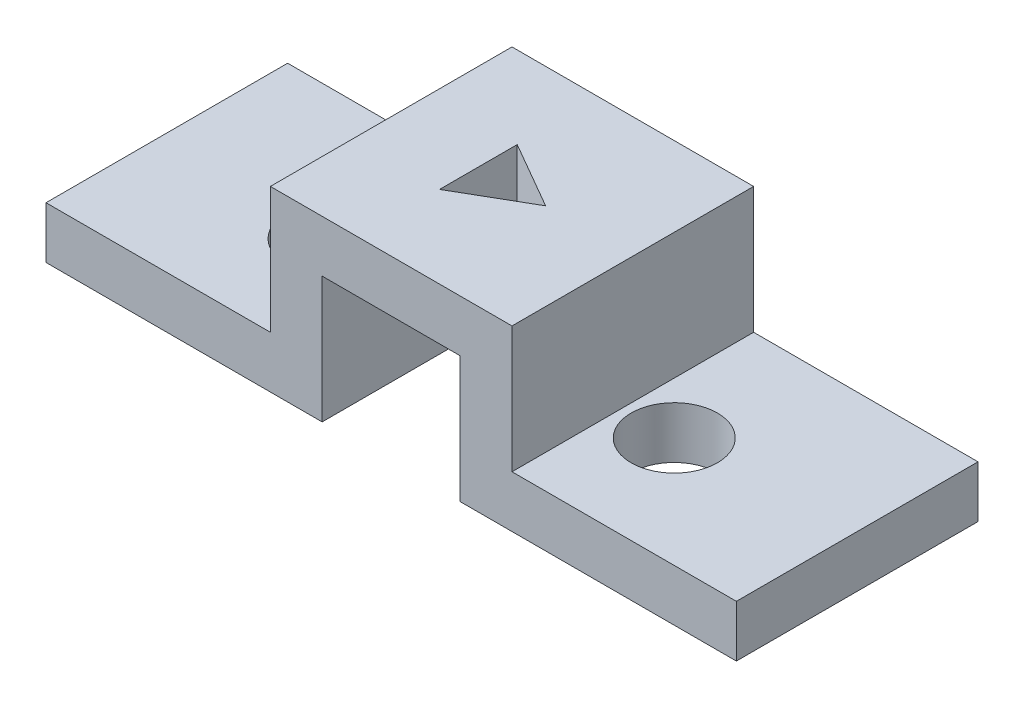
ISO-10303-21;
HEADER;
FILE_DESCRIPTION(('STEP AP214'),'2;1');
FILE_NAME('part.step','',(''),(''),'','','');
FILE_SCHEMA(('AUTOMOTIVE_DESIGN { 1 0 10303 214 1 1 1 1 }'));
ENDSEC;
DATA;
#1=APPLICATION_CONTEXT('core data for automotive mechanical design processes');
#2=APPLICATION_PROTOCOL_DEFINITION('international standard','automotive_design',2000,#1);
#3=PRODUCT_CONTEXT('',#1,'mechanical');
#4=PRODUCT('Part','Part','',(#3));
#5=PRODUCT_RELATED_PRODUCT_CATEGORY('part','',(#4));
#6=PRODUCT_DEFINITION_FORMATION('','',#4);
#7=PRODUCT_DEFINITION_CONTEXT('part definition',#1,'design');
#8=PRODUCT_DEFINITION('design','',#6,#7);
#9=PRODUCT_DEFINITION_SHAPE('','',#8);
#10=(LENGTH_UNIT() NAMED_UNIT(*) SI_UNIT(.MILLI.,.METRE.));
#11=(NAMED_UNIT(*) PLANE_ANGLE_UNIT() SI_UNIT($,.RADIAN.));
#12=(NAMED_UNIT(*) SI_UNIT($,.STERADIAN.) SOLID_ANGLE_UNIT());
#13=UNCERTAINTY_MEASURE_WITH_UNIT(LENGTH_MEASURE(1.E-05),#10,'distance_accuracy_value','');
#14=(GEOMETRIC_REPRESENTATION_CONTEXT(3) GLOBAL_UNCERTAINTY_ASSIGNED_CONTEXT((#13)) GLOBAL_UNIT_ASSIGNED_CONTEXT((#10,
#11,#12)) REPRESENTATION_CONTEXT('',''));
#15=CARTESIAN_POINT('',(0.,0.,0.));
#16=DIRECTION('',(0.,0.,1.));
#17=DIRECTION('',(1.,0.,0.));
#18=AXIS2_PLACEMENT_3D('',#15,#16,#17);
#19=CARTESIAN_POINT('',(-10.,-2.15909090909091,7.));
#20=DIRECTION('',(1.,0.,0.));
#21=DIRECTION('',(0.,1.,0.));
#22=AXIS2_PLACEMENT_3D('',#19,#20,#21);
#23=PLANE('',#22);
#24=DIRECTION('',(0.,-1.,0.));
#25=VECTOR('',#24,1.);
#26=CARTESIAN_POINT('',(-10.,-2.15909090909091,0.));
#27=LINE('',#26,#25);
#28=CARTESIAN_POINT('',(-10.,-2.15909090909091,0.));
#29=VERTEX_POINT('',#28);
#30=CARTESIAN_POINT('',(-10.,-3.65909090909091,0.));
#31=VERTEX_POINT('',#30);
#32=EDGE_CURVE('E186',#29,#31,#27,.T.);
#33=ORIENTED_EDGE('',*,*,#32,.T.);
#34=DIRECTION('',(0.,0.,-1.));
#35=VECTOR('',#34,1.);
#36=CARTESIAN_POINT('',(-10.,-3.65909090909091,7.));
#37=LINE('',#36,#35);
#38=CARTESIAN_POINT('',(-10.,-3.65909090909091,7.));
#39=VERTEX_POINT('',#38);
#40=EDGE_CURVE('E11',#39,#31,#37,.T.);
#41=ORIENTED_EDGE('',*,*,#40,.F.);
#42=DIRECTION('',(0.,-1.,0.));
#43=VECTOR('',#42,1.);
#44=CARTESIAN_POINT('',(-10.,-2.15909090909091,7.));
#45=LINE('',#44,#43);
#46=CARTESIAN_POINT('',(-10.,-2.15909090909091,7.));
#47=VERTEX_POINT('',#46);
#48=EDGE_CURVE('E190',#47,#39,#45,.T.);
#49=ORIENTED_EDGE('',*,*,#48,.F.);
#50=DIRECTION('',(0.,0.,-1.));
#51=VECTOR('',#50,1.);
#52=CARTESIAN_POINT('',(-10.,-2.15909090909091,7.));
#53=LINE('',#52,#51);
#54=EDGE_CURVE('E213',#47,#29,#53,.T.);
#55=ORIENTED_EDGE('',*,*,#54,.T.);
#56=EDGE_LOOP('',(#33,#41,#49,#55));
#57=FACE_BOUND('',#56,.T.);
#58=ADVANCED_FACE('F41',(#57),#23,.F.);
#59=CARTESIAN_POINT('',(-10.,-3.65909090909091,7.));
#60=DIRECTION('',(0.,1.,0.));
#61=DIRECTION('',(0.,0.,1.));
#62=AXIS2_PLACEMENT_3D('',#59,#60,#61);
#63=PLANE('',#62);
#64=CARTESIAN_POINT('',(-5.00078643762691,-3.65909090909091,3.7999999999996));
#65=DIRECTION('',(0.,1.,0.));
#66=DIRECTION('',(0.,0.,-1.));
#67=AXIS2_PLACEMENT_3D('',#64,#65,#66);
#68=CIRCLE('',#67,1.25);
#69=CARTESIAN_POINT('',(-5.00078643762691,-3.65909090909091,2.5499999999996));
#70=VERTEX_POINT('',#69);
#71=EDGE_CURVE('E174',#70,#70,#68,.T.);
#72=ORIENTED_EDGE('',*,*,#71,.T.);
#73=EDGE_LOOP('',(#72));
#74=FACE_BOUND('',#73,.T.);
#75=DIRECTION('',(1.,0.,0.));
#76=VECTOR('',#75,1.);
#77=CARTESIAN_POINT('',(-10.,-3.65909090909091,0.));
#78=LINE('',#77,#76);
#79=CARTESIAN_POINT('',(-2.,-3.65909090909091,0.));
#80=VERTEX_POINT('',#79);
#81=EDGE_CURVE('E216',#31,#80,#78,.T.);
#82=ORIENTED_EDGE('',*,*,#81,.T.);
#83=DIRECTION('',(0.,0.,-1.));
#84=VECTOR('',#83,1.);
#85=CARTESIAN_POINT('',(-2.,-3.65909090909091,7.));
#86=LINE('',#85,#84);
#87=CARTESIAN_POINT('',(-2.,-3.65909090909091,7.));
#88=VERTEX_POINT('',#87);
#89=EDGE_CURVE('E48',#88,#80,#86,.T.);
#90=ORIENTED_EDGE('',*,*,#89,.F.);
#91=DIRECTION('',(1.,0.,0.));
#92=VECTOR('',#91,1.);
#93=CARTESIAN_POINT('',(-10.,-3.65909090909091,7.));
#94=LINE('',#93,#92);
#95=EDGE_CURVE('E189',#39,#88,#94,.T.);
#96=ORIENTED_EDGE('',*,*,#95,.F.);
#97=ORIENTED_EDGE('',*,*,#40,.T.);
#98=EDGE_LOOP('',(#82,#90,#96,#97));
#99=FACE_BOUND('',#98,.T.);
#100=ADVANCED_FACE('F291',(#74,#99),#63,.F.);
#101=CARTESIAN_POINT('',(-2.,-3.65909090909091,7.));
#102=DIRECTION('',(-1.,0.,0.));
#103=DIRECTION('',(0.,0.,1.));
#104=AXIS2_PLACEMENT_3D('',#101,#102,#103);
#105=PLANE('',#104);
#106=DIRECTION('',(0.,1.,0.));
#107=VECTOR('',#106,1.);
#108=CARTESIAN_POINT('',(-2.,-3.65909090909091,0.));
#109=LINE('',#108,#107);
#110=CARTESIAN_POINT('',(-2.,0.,0.));
#111=VERTEX_POINT('',#110);
#112=EDGE_CURVE('E217',#80,#111,#109,.T.);
#113=ORIENTED_EDGE('',*,*,#112,.T.);
#114=DIRECTION('',(0.,0.,-1.));
#115=VECTOR('',#114,1.);
#116=CARTESIAN_POINT('',(-2.,0.,7.));
#117=LINE('',#116,#115);
#118=CARTESIAN_POINT('',(-2.,0.,7.));
#119=VERTEX_POINT('',#118);
#120=EDGE_CURVE('E263',#119,#111,#117,.T.);
#121=ORIENTED_EDGE('',*,*,#120,.F.);
#122=DIRECTION('',(0.,1.,0.));
#123=VECTOR('',#122,1.);
#124=CARTESIAN_POINT('',(-2.,-3.65909090909091,7.));
#125=LINE('',#124,#123);
#126=EDGE_CURVE('E191',#88,#119,#125,.T.);
#127=ORIENTED_EDGE('',*,*,#126,.F.);
#128=ORIENTED_EDGE('',*,*,#89,.T.);
#129=EDGE_LOOP('',(#113,#121,#127,#128));
#130=FACE_BOUND('',#129,.T.);
#131=ADVANCED_FACE('F269',(#130),#105,.F.);
#132=CARTESIAN_POINT('',(-2.,0.,7.));
#133=DIRECTION('',(0.,1.,0.));
#134=DIRECTION('',(0.,0.,1.));
#135=AXIS2_PLACEMENT_3D('',#132,#133,#134);
#136=PLANE('',#135);
#137=DIRECTION('',(-0.866025403784439,0.,0.5));
#138=VECTOR('',#137,1.);
#139=CARTESIAN_POINT('',(0.974278579257494,0.,3.5));
#140=LINE('',#139,#138);
#141=CARTESIAN_POINT('',(0.974278579257493,0.,3.5));
#142=VERTEX_POINT('',#141);
#143=CARTESIAN_POINT('',(-0.974278579257493,0.,4.625));
#144=VERTEX_POINT('',#143);
#145=EDGE_CURVE('E167',#142,#144,#140,.T.);
#146=ORIENTED_EDGE('',*,*,#145,.F.);
#147=DIRECTION('',(0.866025403784438,0.,0.5));
#148=VECTOR('',#147,1.);
#149=CARTESIAN_POINT('',(-0.974278579257493,0.,2.375));
#150=LINE('',#149,#148);
#151=CARTESIAN_POINT('',(-0.974278579257493,0.,2.375));
#152=VERTEX_POINT('',#151);
#153=EDGE_CURVE('E54',#152,#142,#150,.T.);
#154=ORIENTED_EDGE('',*,*,#153,.F.);
#155=DIRECTION('',(0.,0.,-1.));
#156=VECTOR('',#155,1.);
#157=CARTESIAN_POINT('',(-0.974278579257493,0.,4.625));
#158=LINE('',#157,#156);
#159=EDGE_CURVE('E152',#144,#152,#158,.T.);
#160=ORIENTED_EDGE('',*,*,#159,.F.);
#161=EDGE_LOOP('',(#146,#154,#160));
#162=FACE_BOUND('',#161,.T.);
#163=DIRECTION('',(1.,0.,0.));
#164=VECTOR('',#163,1.);
#165=CARTESIAN_POINT('',(-2.,0.,0.));
#166=LINE('',#165,#164);
#167=CARTESIAN_POINT('',(2.,0.,0.));
#168=VERTEX_POINT('',#167);
#169=EDGE_CURVE('E219',#111,#168,#166,.T.);
#170=ORIENTED_EDGE('',*,*,#169,.T.);
#171=DIRECTION('',(0.,0.,-1.));
#172=VECTOR('',#171,1.);
#173=CARTESIAN_POINT('',(2.,0.,7.));
#174=LINE('',#173,#172);
#175=CARTESIAN_POINT('',(2.,0.,7.));
#176=VERTEX_POINT('',#175);
#177=EDGE_CURVE('E257',#176,#168,#174,.T.);
#178=ORIENTED_EDGE('',*,*,#177,.F.);
#179=DIRECTION('',(1.,0.,0.));
#180=VECTOR('',#179,1.);
#181=CARTESIAN_POINT('',(-2.,0.,7.));
#182=LINE('',#181,#180);
#183=EDGE_CURVE('E192',#119,#176,#182,.T.);
#184=ORIENTED_EDGE('',*,*,#183,.F.);
#185=ORIENTED_EDGE('',*,*,#120,.T.);
#186=EDGE_LOOP('',(#170,#178,#184,#185));
#187=FACE_BOUND('',#186,.T.);
#188=ADVANCED_FACE('F281',(#162,#187),#136,.F.);
#189=CARTESIAN_POINT('',(2.,-3.65909090909091,7.));
#190=DIRECTION('',(1.,0.,0.));
#191=DIRECTION('',(0.,0.,-1.));
#192=AXIS2_PLACEMENT_3D('',#189,#190,#191);
#193=PLANE('',#192);
#194=DIRECTION('',(0.,-1.,0.));
#195=VECTOR('',#194,1.);
#196=CARTESIAN_POINT('',(2.,-3.65909090909091,0.));
#197=LINE('',#196,#195);
#198=CARTESIAN_POINT('',(2.,-3.65909090909091,0.));
#199=VERTEX_POINT('',#198);
#200=EDGE_CURVE('E225',#168,#199,#197,.T.);
#201=ORIENTED_EDGE('',*,*,#200,.T.);
#202=DIRECTION('',(0.,0.,-1.));
#203=VECTOR('',#202,1.);
#204=CARTESIAN_POINT('',(2.,-3.65909090909091,7.));
#205=LINE('',#204,#203);
#206=CARTESIAN_POINT('',(2.,-3.65909090909091,7.));
#207=VERTEX_POINT('',#206);
#208=EDGE_CURVE('E260',#207,#199,#205,.T.);
#209=ORIENTED_EDGE('',*,*,#208,.F.);
#210=DIRECTION('',(0.,-1.,0.));
#211=VECTOR('',#210,1.);
#212=CARTESIAN_POINT('',(2.,-3.65909090909091,7.));
#213=LINE('',#212,#211);
#214=EDGE_CURVE('E197',#176,#207,#213,.T.);
#215=ORIENTED_EDGE('',*,*,#214,.F.);
#216=ORIENTED_EDGE('',*,*,#177,.T.);
#217=EDGE_LOOP('',(#201,#209,#215,#216));
#218=FACE_BOUND('',#217,.T.);
#219=ADVANCED_FACE('F284',(#218),#193,.F.);
#220=CARTESIAN_POINT('',(10.,-3.65909090909091,7.));
#221=DIRECTION('',(0.,1.,0.));
#222=DIRECTION('',(0.,0.,1.));
#223=AXIS2_PLACEMENT_3D('',#220,#221,#222);
#224=PLANE('',#223);
#225=CARTESIAN_POINT('',(5.00078643762691,-3.65909090909091,3.7999999999996));
#226=DIRECTION('',(0.,-1.,0.));
#227=DIRECTION('',(0.,0.,-1.));
#228=AXIS2_PLACEMENT_3D('',#225,#226,#227);
#229=CIRCLE('',#228,1.25);
#230=CARTESIAN_POINT('',(5.00078643762691,-3.65909090909091,2.5499999999996));
#231=VERTEX_POINT('',#230);
#232=EDGE_CURVE('E176',#231,#231,#229,.T.);
#233=ORIENTED_EDGE('',*,*,#232,.F.);
#234=EDGE_LOOP('',(#233));
#235=FACE_BOUND('',#234,.T.);
#236=DIRECTION('',(1.,0.,0.));
#237=VECTOR('',#236,1.);
#238=CARTESIAN_POINT('',(10.,-3.65909090909091,0.));
#239=LINE('',#238,#237);
#240=CARTESIAN_POINT('',(10.,-3.65909090909091,0.));
#241=VERTEX_POINT('',#240);
#242=EDGE_CURVE('E221',#199,#241,#239,.T.);
#243=ORIENTED_EDGE('',*,*,#242,.T.);
#244=DIRECTION('',(0.,0.,-1.));
#245=VECTOR('',#244,1.);
#246=CARTESIAN_POINT('',(10.,-3.65909090909091,7.));
#247=LINE('',#246,#245);
#248=CARTESIAN_POINT('',(10.,-3.65909090909091,7.));
#249=VERTEX_POINT('',#248);
#250=EDGE_CURVE('E255',#249,#241,#247,.T.);
#251=ORIENTED_EDGE('',*,*,#250,.F.);
#252=DIRECTION('',(1.,0.,0.));
#253=VECTOR('',#252,1.);
#254=CARTESIAN_POINT('',(10.,-3.65909090909091,7.));
#255=LINE('',#254,#253);
#256=EDGE_CURVE('E200',#207,#249,#255,.T.);
#257=ORIENTED_EDGE('',*,*,#256,.F.);
#258=ORIENTED_EDGE('',*,*,#208,.T.);
#259=EDGE_LOOP('',(#243,#251,#257,#258));
#260=FACE_BOUND('',#259,.T.);
#261=ADVANCED_FACE('F322',(#235,#260),#224,.F.);
#262=CARTESIAN_POINT('',(10.,-2.15909090909091,7.));
#263=DIRECTION('',(-1.,0.,0.));
#264=DIRECTION('',(0.,-1.,0.));
#265=AXIS2_PLACEMENT_3D('',#262,#263,#264);
#266=PLANE('',#265);
#267=DIRECTION('',(0.,1.,0.));
#268=VECTOR('',#267,1.);
#269=CARTESIAN_POINT('',(10.,-2.15909090909091,0.));
#270=LINE('',#269,#268);
#271=CARTESIAN_POINT('',(10.,-2.15909090909091,0.));
#272=VERTEX_POINT('',#271);
#273=EDGE_CURVE('E226',#241,#272,#270,.T.);
#274=ORIENTED_EDGE('',*,*,#273,.T.);
#275=DIRECTION('',(0.,0.,-1.));
#276=VECTOR('',#275,1.);
#277=CARTESIAN_POINT('',(10.,-2.15909090909091,7.));
#278=LINE('',#277,#276);
#279=CARTESIAN_POINT('',(10.,-2.15909090909091,7.));
#280=VERTEX_POINT('',#279);
#281=EDGE_CURVE('E253',#280,#272,#278,.T.);
#282=ORIENTED_EDGE('',*,*,#281,.F.);
#283=DIRECTION('',(0.,1.,0.));
#284=VECTOR('',#283,1.);
#285=CARTESIAN_POINT('',(10.,-2.15909090909091,7.));
#286=LINE('',#285,#284);
#287=EDGE_CURVE('E203',#249,#280,#286,.T.);
#288=ORIENTED_EDGE('',*,*,#287,.F.);
#289=ORIENTED_EDGE('',*,*,#250,.T.);
#290=EDGE_LOOP('',(#274,#282,#288,#289));
#291=FACE_BOUND('',#290,.T.);
#292=ADVANCED_FACE('F325',(#291),#266,.F.);
#293=CARTESIAN_POINT('',(3.5,-2.15909090909091,7.));
#294=DIRECTION('',(0.,-1.,0.));
#295=DIRECTION('',(1.,0.,0.));
#296=AXIS2_PLACEMENT_3D('',#293,#294,#295);
#297=PLANE('',#296);
#298=CARTESIAN_POINT('',(5.00078643762691,-2.15909090909091,3.7999999999996));
#299=DIRECTION('',(0.,-1.,0.));
#300=DIRECTION('',(1.,0.,0.));
#301=AXIS2_PLACEMENT_3D('',#298,#299,#300);
#302=CIRCLE('',#301,1.25);
#303=CARTESIAN_POINT('',(6.25078643762691,-2.15909090909091,3.7999999999996));
#304=VERTEX_POINT('',#303);
#305=EDGE_CURVE('E181',#304,#304,#302,.F.);
#306=ORIENTED_EDGE('',*,*,#305,.F.);
#307=EDGE_LOOP('',(#306));
#308=FACE_BOUND('',#307,.T.);
#309=DIRECTION('',(-1.,0.,0.));
#310=VECTOR('',#309,1.);
#311=CARTESIAN_POINT('',(3.5,-2.15909090909091,0.));
#312=LINE('',#311,#310);
#313=CARTESIAN_POINT('',(3.5,-2.15909090909091,0.));
#314=VERTEX_POINT('',#313);
#315=EDGE_CURVE('E227',#272,#314,#312,.T.);
#316=ORIENTED_EDGE('',*,*,#315,.T.);
#317=DIRECTION('',(0.,0.,-1.));
#318=VECTOR('',#317,1.);
#319=CARTESIAN_POINT('',(3.5,-2.15909090909091,7.));
#320=LINE('',#319,#318);
#321=CARTESIAN_POINT('',(3.5,-2.15909090909091,7.));
#322=VERTEX_POINT('',#321);
#323=EDGE_CURVE('E246',#322,#314,#320,.T.);
#324=ORIENTED_EDGE('',*,*,#323,.F.);
#325=DIRECTION('',(-1.,0.,0.));
#326=VECTOR('',#325,1.);
#327=CARTESIAN_POINT('',(3.5,-2.15909090909091,7.));
#328=LINE('',#327,#326);
#329=EDGE_CURVE('E201',#280,#322,#328,.T.);
#330=ORIENTED_EDGE('',*,*,#329,.F.);
#331=ORIENTED_EDGE('',*,*,#281,.T.);
#332=EDGE_LOOP('',(#316,#324,#330,#331));
#333=FACE_BOUND('',#332,.T.);
#334=ADVANCED_FACE('F318',(#308,#333),#297,.F.);
#335=CARTESIAN_POINT('',(3.5,1.5,7.));
#336=DIRECTION('',(-1.,0.,0.));
#337=DIRECTION('',(0.,-1.,0.));
#338=AXIS2_PLACEMENT_3D('',#335,#336,#337);
#339=PLANE('',#338);
#340=DIRECTION('',(0.,1.,0.));
#341=VECTOR('',#340,1.);
#342=CARTESIAN_POINT('',(3.5,1.5,0.));
#343=LINE('',#342,#341);
#344=CARTESIAN_POINT('',(3.5,1.5,0.));
#345=VERTEX_POINT('',#344);
#346=EDGE_CURVE('E229',#314,#345,#343,.T.);
#347=ORIENTED_EDGE('',*,*,#346,.T.);
#348=DIRECTION('',(0.,0.,-1.));
#349=VECTOR('',#348,1.);
#350=CARTESIAN_POINT('',(3.5,1.5,7.));
#351=LINE('',#350,#349);
#352=CARTESIAN_POINT('',(3.5,1.5,7.));
#353=VERTEX_POINT('',#352);
#354=EDGE_CURVE('E244',#353,#345,#351,.T.);
#355=ORIENTED_EDGE('',*,*,#354,.F.);
#356=DIRECTION('',(0.,1.,0.));
#357=VECTOR('',#356,1.);
#358=CARTESIAN_POINT('',(3.5,1.5,7.));
#359=LINE('',#358,#357);
#360=EDGE_CURVE('E202',#322,#353,#359,.T.);
#361=ORIENTED_EDGE('',*,*,#360,.F.);
#362=ORIENTED_EDGE('',*,*,#323,.T.);
#363=EDGE_LOOP('',(#347,#355,#361,#362));
#364=FACE_BOUND('',#363,.T.);
#365=ADVANCED_FACE('F311',(#364),#339,.F.);
#366=CARTESIAN_POINT('',(3.5,1.5,7.));
#367=DIRECTION('',(0.,-1.,0.));
#368=DIRECTION('',(0.,0.,-1.));
#369=AXIS2_PLACEMENT_3D('',#366,#367,#368);
#370=PLANE('',#369);
#371=DIRECTION('',(0.,0.,1.));
#372=VECTOR('',#371,1.);
#373=CARTESIAN_POINT('',(-0.974278579257493,1.5,4.625));
#374=LINE('',#373,#372);
#375=CARTESIAN_POINT('',(-0.974278579257493,1.5,2.375));
#376=VERTEX_POINT('',#375);
#377=CARTESIAN_POINT('',(-0.974278579257493,1.5,4.625));
#378=VERTEX_POINT('',#377);
#379=EDGE_CURVE('E62',#376,#378,#374,.T.);
#380=ORIENTED_EDGE('',*,*,#379,.F.);
#381=DIRECTION('',(-0.866025403784439,0.,-0.5));
#382=VECTOR('',#381,1.);
#383=CARTESIAN_POINT('',(-0.974278579257493,1.5,2.375));
#384=LINE('',#383,#382);
#385=CARTESIAN_POINT('',(0.974278579257494,1.5,3.5));
#386=VERTEX_POINT('',#385);
#387=EDGE_CURVE('E149',#386,#376,#384,.T.);
#388=ORIENTED_EDGE('',*,*,#387,.F.);
#389=DIRECTION('',(0.866025403784439,0.,-0.5));
#390=VECTOR('',#389,1.);
#391=CARTESIAN_POINT('',(0.974278579257494,1.5,3.5));
#392=LINE('',#391,#390);
#393=EDGE_CURVE('E160',#378,#386,#392,.T.);
#394=ORIENTED_EDGE('',*,*,#393,.F.);
#395=EDGE_LOOP('',(#380,#388,#394));
#396=FACE_BOUND('',#395,.T.);
#397=DIRECTION('',(-1.,0.,0.));
#398=VECTOR('',#397,1.);
#399=CARTESIAN_POINT('',(3.5,1.5,0.));
#400=LINE('',#399,#398);
#401=CARTESIAN_POINT('',(-3.5,1.5,0.));
#402=VERTEX_POINT('',#401);
#403=EDGE_CURVE('E235',#345,#402,#400,.T.);
#404=ORIENTED_EDGE('',*,*,#403,.T.);
#405=DIRECTION('',(0.,0.,-1.));
#406=VECTOR('',#405,1.);
#407=CARTESIAN_POINT('',(-3.5,1.5,7.));
#408=LINE('',#407,#406);
#409=CARTESIAN_POINT('',(-3.5,1.5,7.));
#410=VERTEX_POINT('',#409);
#411=EDGE_CURVE('E245',#410,#402,#408,.T.);
#412=ORIENTED_EDGE('',*,*,#411,.F.);
#413=DIRECTION('',(-1.,0.,0.));
#414=VECTOR('',#413,1.);
#415=CARTESIAN_POINT('',(3.5,1.5,7.));
#416=LINE('',#415,#414);
#417=EDGE_CURVE('E210',#353,#410,#416,.T.);
#418=ORIENTED_EDGE('',*,*,#417,.F.);
#419=ORIENTED_EDGE('',*,*,#354,.T.);
#420=EDGE_LOOP('',(#404,#412,#418,#419));
#421=FACE_BOUND('',#420,.T.);
#422=ADVANCED_FACE('F162',(#396,#421),#370,.F.);
#423=CARTESIAN_POINT('',(-3.5,1.5,7.));
#424=DIRECTION('',(1.,0.,0.));
#425=DIRECTION('',(0.,1.,0.));
#426=AXIS2_PLACEMENT_3D('',#423,#424,#425);
#427=PLANE('',#426);
#428=DIRECTION('',(0.,-1.,0.));
#429=VECTOR('',#428,1.);
#430=CARTESIAN_POINT('',(-3.5,1.5,0.));
#431=LINE('',#430,#429);
#432=CARTESIAN_POINT('',(-3.5,-2.15909090909091,0.));
#433=VERTEX_POINT('',#432);
#434=EDGE_CURVE('E234',#402,#433,#431,.T.);
#435=ORIENTED_EDGE('',*,*,#434,.T.);
#436=DIRECTION('',(0.,0.,-1.));
#437=VECTOR('',#436,1.);
#438=CARTESIAN_POINT('',(-3.5,-2.15909090909091,7.));
#439=LINE('',#438,#437);
#440=CARTESIAN_POINT('',(-3.5,-2.15909090909091,7.));
#441=VERTEX_POINT('',#440);
#442=EDGE_CURVE('E239',#441,#433,#439,.T.);
#443=ORIENTED_EDGE('',*,*,#442,.F.);
#444=DIRECTION('',(0.,-1.,0.));
#445=VECTOR('',#444,1.);
#446=CARTESIAN_POINT('',(-3.5,1.5,7.));
#447=LINE('',#446,#445);
#448=EDGE_CURVE('E207',#410,#441,#447,.T.);
#449=ORIENTED_EDGE('',*,*,#448,.F.);
#450=ORIENTED_EDGE('',*,*,#411,.T.);
#451=EDGE_LOOP('',(#435,#443,#449,#450));
#452=FACE_BOUND('',#451,.T.);
#453=ADVANCED_FACE('F302',(#452),#427,.F.);
#454=CARTESIAN_POINT('',(-3.5,-2.15909090909091,7.));
#455=DIRECTION('',(0.,-1.,0.));
#456=DIRECTION('',(1.,0.,0.));
#457=AXIS2_PLACEMENT_3D('',#454,#455,#456);
#458=PLANE('',#457);
#459=CARTESIAN_POINT('',(-5.00078643762691,-2.15909090909091,3.7999999999996));
#460=DIRECTION('',(0.,-1.,0.));
#461=DIRECTION('',(1.,0.,0.));
#462=AXIS2_PLACEMENT_3D('',#459,#460,#461);
#463=CIRCLE('',#462,1.25);
#464=CARTESIAN_POINT('',(-3.75078643762691,-2.15909090909091,3.7999999999996));
#465=VERTEX_POINT('',#464);
#466=EDGE_CURVE('E159',#465,#465,#463,.T.);
#467=ORIENTED_EDGE('',*,*,#466,.T.);
#468=EDGE_LOOP('',(#467));
#469=FACE_BOUND('',#468,.T.);
#470=DIRECTION('',(-1.,0.,0.));
#471=VECTOR('',#470,1.);
#472=CARTESIAN_POINT('',(-3.5,-2.15909090909091,0.));
#473=LINE('',#472,#471);
#474=EDGE_CURVE('E193',#433,#29,#473,.T.);
#475=ORIENTED_EDGE('',*,*,#474,.T.);
#476=ORIENTED_EDGE('',*,*,#54,.F.);
#477=DIRECTION('',(-1.,0.,0.));
#478=VECTOR('',#477,1.);
#479=CARTESIAN_POINT('',(-3.5,-2.15909090909091,7.));
#480=LINE('',#479,#478);
#481=EDGE_CURVE('E211',#441,#47,#480,.T.);
#482=ORIENTED_EDGE('',*,*,#481,.F.);
#483=ORIENTED_EDGE('',*,*,#442,.T.);
#484=EDGE_LOOP('',(#475,#476,#482,#483));
#485=FACE_BOUND('',#484,.T.);
#486=ADVANCED_FACE('F299',(#469,#485),#458,.F.);
#487=CARTESIAN_POINT('',(0.,0.,7.));
#488=DIRECTION('',(0.,0.,1.));
#489=DIRECTION('',(1.,0.,0.));
#490=AXIS2_PLACEMENT_3D('',#487,#488,#489);
#491=PLANE('',#490);
#492=ORIENTED_EDGE('',*,*,#48,.T.);
#493=ORIENTED_EDGE('',*,*,#95,.T.);
#494=ORIENTED_EDGE('',*,*,#126,.T.);
#495=ORIENTED_EDGE('',*,*,#183,.T.);
#496=ORIENTED_EDGE('',*,*,#214,.T.);
#497=ORIENTED_EDGE('',*,*,#256,.T.);
#498=ORIENTED_EDGE('',*,*,#287,.T.);
#499=ORIENTED_EDGE('',*,*,#329,.T.);
#500=ORIENTED_EDGE('',*,*,#360,.T.);
#501=ORIENTED_EDGE('',*,*,#417,.T.);
#502=ORIENTED_EDGE('',*,*,#448,.T.);
#503=ORIENTED_EDGE('',*,*,#481,.T.);
#504=EDGE_LOOP('',(#492,#493,#494,#495,#496,#497,#498,#499,#500,#501,#502,#503));
#505=FACE_BOUND('',#504,.T.);
#506=ADVANCED_FACE('F289',(#505),#491,.T.);
#507=CARTESIAN_POINT('',(0.,0.,0.));
#508=DIRECTION('',(0.,0.,1.));
#509=DIRECTION('',(1.,0.,0.));
#510=AXIS2_PLACEMENT_3D('',#507,#508,#509);
#511=PLANE('',#510);
#512=ORIENTED_EDGE('',*,*,#32,.F.);
#513=ORIENTED_EDGE('',*,*,#474,.F.);
#514=ORIENTED_EDGE('',*,*,#434,.F.);
#515=ORIENTED_EDGE('',*,*,#403,.F.);
#516=ORIENTED_EDGE('',*,*,#346,.F.);
#517=ORIENTED_EDGE('',*,*,#315,.F.);
#518=ORIENTED_EDGE('',*,*,#273,.F.);
#519=ORIENTED_EDGE('',*,*,#242,.F.);
#520=ORIENTED_EDGE('',*,*,#200,.F.);
#521=ORIENTED_EDGE('',*,*,#169,.F.);
#522=ORIENTED_EDGE('',*,*,#112,.F.);
#523=ORIENTED_EDGE('',*,*,#81,.F.);
#524=EDGE_LOOP('',(#512,#513,#514,#515,#516,#517,#518,#519,#520,#521,#522,#523));
#525=FACE_BOUND('',#524,.T.);
#526=ADVANCED_FACE('F277',(#525),#511,.F.);
#527=CARTESIAN_POINT('',(5.00078643762691,1.501,3.7999999999996));
#528=DIRECTION('',(0.,-1.,0.));
#529=DIRECTION('',(0.,0.,-1.));
#530=AXIS2_PLACEMENT_3D('',#527,#528,#529);
#531=CYLINDRICAL_SURFACE('',#530,1.25);
#532=ORIENTED_EDGE('',*,*,#232,.T.);
#533=EDGE_LOOP('',(#532));
#534=FACE_BOUND('',#533,.T.);
#535=ORIENTED_EDGE('',*,*,#305,.T.);
#536=EDGE_LOOP('',(#535));
#537=FACE_BOUND('',#536,.T.);
#538=ADVANCED_FACE('F366',(#534,#537),#531,.F.);
#539=CARTESIAN_POINT('',(-5.00078643762691,1.501,3.7999999999996));
#540=DIRECTION('',(0.,-1.,0.));
#541=DIRECTION('',(0.,0.,-1.));
#542=AXIS2_PLACEMENT_3D('',#539,#540,#541);
#543=CYLINDRICAL_SURFACE('',#542,1.25);
#544=ORIENTED_EDGE('',*,*,#71,.F.);
#545=EDGE_LOOP('',(#544));
#546=FACE_BOUND('',#545,.T.);
#547=ORIENTED_EDGE('',*,*,#466,.F.);
#548=EDGE_LOOP('',(#547));
#549=FACE_BOUND('',#548,.T.);
#550=ADVANCED_FACE('F365',(#546,#549),#543,.F.);
#551=CARTESIAN_POINT('',(-0.974278579257493,1.501,2.375));
#552=DIRECTION('',(0.5,0.,-0.866025403784438));
#553=DIRECTION('',(-0.866025403784439,0.,-0.5));
#554=AXIS2_PLACEMENT_3D('',#551,#552,#553);
#555=PLANE('',#554);
#556=ORIENTED_EDGE('',*,*,#387,.T.);
#557=DIRECTION('',(0.,-1.,0.));
#558=VECTOR('',#557,1.);
#559=CARTESIAN_POINT('',(-0.974278579257493,1.501,2.375));
#560=LINE('',#559,#558);
#561=EDGE_CURVE('E161',#376,#152,#560,.T.);
#562=ORIENTED_EDGE('',*,*,#561,.T.);
#563=ORIENTED_EDGE('',*,*,#153,.T.);
#564=DIRECTION('',(0.,-1.,0.));
#565=VECTOR('',#564,1.);
#566=CARTESIAN_POINT('',(0.974278579257494,1.501,3.5));
#567=LINE('',#566,#565);
#568=EDGE_CURVE('E144',#386,#142,#567,.T.);
#569=ORIENTED_EDGE('',*,*,#568,.F.);
#570=EDGE_LOOP('',(#556,#562,#563,#569));
#571=FACE_BOUND('',#570,.T.);
#572=ADVANCED_FACE('F150',(#571),#555,.F.);
#573=CARTESIAN_POINT('',(-0.974278579257493,1.501,4.625));
#574=DIRECTION('',(-1.,0.,0.));
#575=DIRECTION('',(0.,0.,1.));
#576=AXIS2_PLACEMENT_3D('',#573,#574,#575);
#577=PLANE('',#576);
#578=ORIENTED_EDGE('',*,*,#379,.T.);
#579=DIRECTION('',(0.,-1.,0.));
#580=VECTOR('',#579,1.);
#581=CARTESIAN_POINT('',(-0.974278579257493,1.501,4.625));
#582=LINE('',#581,#580);
#583=EDGE_CURVE('E153',#378,#144,#582,.T.);
#584=ORIENTED_EDGE('',*,*,#583,.T.);
#585=ORIENTED_EDGE('',*,*,#159,.T.);
#586=ORIENTED_EDGE('',*,*,#561,.F.);
#587=EDGE_LOOP('',(#578,#584,#585,#586));
#588=FACE_BOUND('',#587,.T.);
#589=ADVANCED_FACE('F358',(#588),#577,.F.);
#590=CARTESIAN_POINT('',(0.974278579257494,1.501,3.5));
#591=DIRECTION('',(0.5,0.,0.866025403784439));
#592=DIRECTION('',(0.866025403784439,0.,-0.5));
#593=AXIS2_PLACEMENT_3D('',#590,#591,#592);
#594=PLANE('',#593);
#595=ORIENTED_EDGE('',*,*,#393,.T.);
#596=ORIENTED_EDGE('',*,*,#568,.T.);
#597=ORIENTED_EDGE('',*,*,#145,.T.);
#598=ORIENTED_EDGE('',*,*,#583,.F.);
#599=EDGE_LOOP('',(#595,#596,#597,#598));
#600=FACE_BOUND('',#599,.T.);
#601=ADVANCED_FACE('F158',(#600),#594,.F.);
#602=CLOSED_SHELL('',(#58,#100,#131,#188,#219,#261,#292,#334,#365,#422,#453,#486,#506,#526,#538,
#550,#572,#589,#601));
#603=MANIFOLD_SOLID_BREP('B2',#602);
#604=ADVANCED_BREP_SHAPE_REPRESENTATION('',(#18,#603),#14);
#605=SHAPE_DEFINITION_REPRESENTATION(#9,#604);
ENDSEC;
END-ISO-10303-21;
